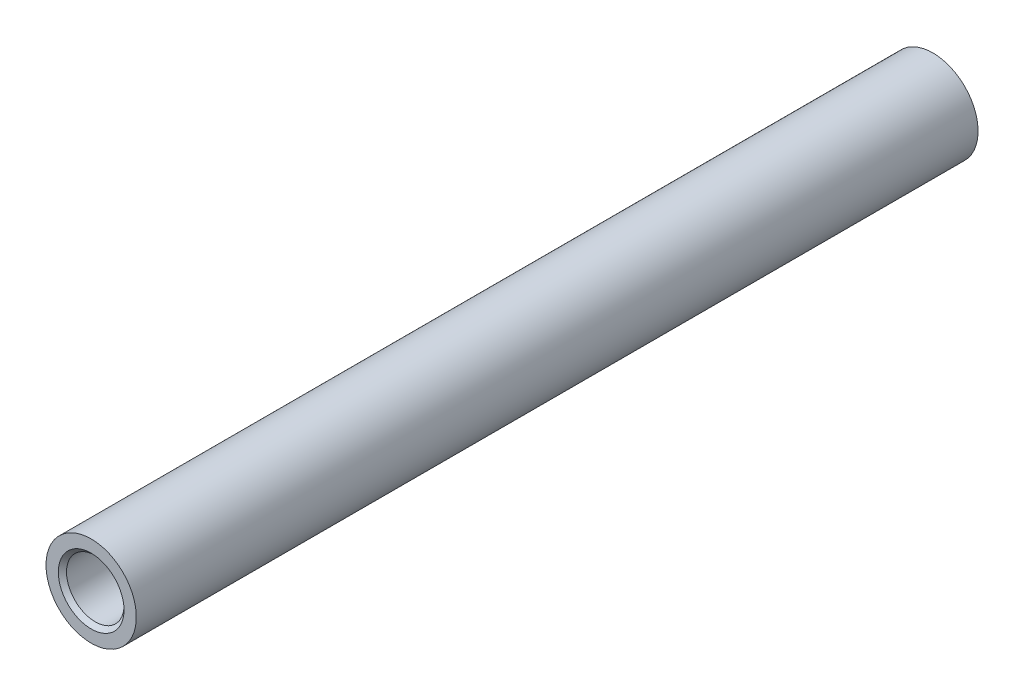
ISO-10303-21;
HEADER;
FILE_DESCRIPTION(('STEP AP214'),'2;1');
FILE_NAME('part.step','',(''),(''),'','','');
FILE_SCHEMA(('AUTOMOTIVE_DESIGN { 1 0 10303 214 1 1 1 1 }'));
ENDSEC;
DATA;
#1=APPLICATION_CONTEXT('core data for automotive mechanical design processes');
#2=APPLICATION_PROTOCOL_DEFINITION('international standard','automotive_design',2000,#1);
#3=PRODUCT_CONTEXT('',#1,'mechanical');
#4=PRODUCT('Part','Part','',(#3));
#5=PRODUCT_RELATED_PRODUCT_CATEGORY('part','',(#4));
#6=PRODUCT_DEFINITION_FORMATION('','',#4);
#7=PRODUCT_DEFINITION_CONTEXT('part definition',#1,'design');
#8=PRODUCT_DEFINITION('design','',#6,#7);
#9=PRODUCT_DEFINITION_SHAPE('','',#8);
#10=(LENGTH_UNIT() NAMED_UNIT(*) SI_UNIT(.MILLI.,.METRE.));
#11=(NAMED_UNIT(*) PLANE_ANGLE_UNIT() SI_UNIT($,.RADIAN.));
#12=(NAMED_UNIT(*) SI_UNIT($,.STERADIAN.) SOLID_ANGLE_UNIT());
#13=UNCERTAINTY_MEASURE_WITH_UNIT(LENGTH_MEASURE(1.E-05),#10,'distance_accuracy_value','');
#14=(GEOMETRIC_REPRESENTATION_CONTEXT(3) GLOBAL_UNCERTAINTY_ASSIGNED_CONTEXT((#13)) GLOBAL_UNIT_ASSIGNED_CONTEXT((#10,
#11,#12)) REPRESENTATION_CONTEXT('',''));
#15=CARTESIAN_POINT('',(0.,0.,0.));
#16=DIRECTION('',(0.,0.,1.));
#17=DIRECTION('',(1.,0.,0.));
#18=AXIS2_PLACEMENT_3D('',#15,#16,#17);
#19=CARTESIAN_POINT('',(0.,0.,102.5));
#20=DIRECTION('',(0.,0.,-1.));
#21=DIRECTION('',(-1.,0.,0.));
#22=AXIS2_PLACEMENT_3D('',#19,#20,#21);
#23=CYLINDRICAL_SURFACE('',#22,7.);
#24=CARTESIAN_POINT('',(0.,0.,101.5));
#25=DIRECTION('',(0.,0.,1.));
#26=DIRECTION('',(1.,0.,0.));
#27=AXIS2_PLACEMENT_3D('',#24,#25,#26);
#28=CIRCLE('',#27,7.);
#29=CARTESIAN_POINT('',(-7.,0.,101.5));
#30=VERTEX_POINT('',#29);
#31=EDGE_CURVE('E43',#30,#30,#28,.T.);
#32=CARTESIAN_POINT('',(0.,0.,-52.5));
#33=DIRECTION('',(0.,0.,-1.));
#34=DIRECTION('',(-1.,0.,0.));
#35=AXIS2_PLACEMENT_3D('',#32,#33,#34);
#36=CIRCLE('',#35,7.);
#37=CARTESIAN_POINT('',(-7.,0.,-52.5));
#38=VERTEX_POINT('',#37);
#39=EDGE_CURVE('E54',#38,#38,#36,.T.);
#40=CARTESIAN_POINT('',(-7.,0.,101.5));
#41=CARTESIAN_POINT('',(-7.,0.,99.8958333333332));
#42=CARTESIAN_POINT('',(-7.,0.,98.2916666666665));
#43=CARTESIAN_POINT('',(-7.,0.,95.0833333333332));
#44=CARTESIAN_POINT('',(-7.,0.,93.4791666666665));
#45=CARTESIAN_POINT('',(-7.,0.,90.2708333333332));
#46=CARTESIAN_POINT('',(-7.,0.,88.6666666666665));
#47=CARTESIAN_POINT('',(-7.,0.,85.4583333333332));
#48=CARTESIAN_POINT('',(-7.,0.,83.8541666666665));
#49=CARTESIAN_POINT('',(-7.,0.,80.6458333333332));
#50=CARTESIAN_POINT('',(-7.,0.,79.0416666666666));
#51=CARTESIAN_POINT('',(-7.,0.,75.8333333333332));
#52=CARTESIAN_POINT('',(-7.,0.,74.2291666666666));
#53=CARTESIAN_POINT('',(-7.,0.,71.0208333333332));
#54=CARTESIAN_POINT('',(-7.,0.,69.4166666666666));
#55=CARTESIAN_POINT('',(-7.,0.,66.2083333333332));
#56=CARTESIAN_POINT('',(-7.,0.,64.6041666666666));
#57=CARTESIAN_POINT('',(-7.,0.,61.3958333333332));
#58=CARTESIAN_POINT('',(-7.,0.,59.7916666666666));
#59=CARTESIAN_POINT('',(-7.,0.,56.5833333333333));
#60=CARTESIAN_POINT('',(-7.,0.,54.9791666666666));
#61=CARTESIAN_POINT('',(-7.,0.,51.7708333333333));
#62=CARTESIAN_POINT('',(-7.,0.,50.1666666666666));
#63=CARTESIAN_POINT('',(-7.,0.,46.9583333333333));
#64=CARTESIAN_POINT('',(-7.,0.,45.3541666666666));
#65=CARTESIAN_POINT('',(-7.,0.,42.1458333333333));
#66=CARTESIAN_POINT('',(-7.,0.,40.5416666666666));
#67=CARTESIAN_POINT('',(-7.,0.,37.3333333333333));
#68=CARTESIAN_POINT('',(-7.,0.,35.7291666666666));
#69=CARTESIAN_POINT('',(-7.,0.,32.5208333333333));
#70=CARTESIAN_POINT('',(-7.,0.,30.9166666666666));
#71=CARTESIAN_POINT('',(-7.,0.,27.7083333333333));
#72=CARTESIAN_POINT('',(-7.,0.,26.1041666666666));
#73=CARTESIAN_POINT('',(-7.,0.,22.8958333333333));
#74=CARTESIAN_POINT('',(-7.,0.,21.2916666666666));
#75=CARTESIAN_POINT('',(-7.,0.,18.0833333333333));
#76=CARTESIAN_POINT('',(-7.,0.,16.4791666666666));
#77=CARTESIAN_POINT('',(-7.,0.,13.2708333333333));
#78=CARTESIAN_POINT('',(-7.,0.,11.6666666666666));
#79=CARTESIAN_POINT('',(-7.,0.,8.45833333333331));
#80=CARTESIAN_POINT('',(-7.,0.,6.85416666666664));
#81=CARTESIAN_POINT('',(-7.,0.,3.64583333333331));
#82=CARTESIAN_POINT('',(-7.,0.,2.04166666666665));
#83=CARTESIAN_POINT('',(-7.,0.,-1.16666666666669));
#84=CARTESIAN_POINT('',(-7.,0.,-2.77083333333335));
#85=CARTESIAN_POINT('',(-7.,0.,-5.97916666666668));
#86=CARTESIAN_POINT('',(-7.,0.,-7.58333333333335));
#87=CARTESIAN_POINT('',(-7.,0.,-10.7916666666667));
#88=CARTESIAN_POINT('',(-7.,0.,-12.3958333333333));
#89=CARTESIAN_POINT('',(-7.,0.,-15.6041666666667));
#90=CARTESIAN_POINT('',(-7.,0.,-17.2083333333333));
#91=CARTESIAN_POINT('',(-7.,0.,-20.4166666666667));
#92=CARTESIAN_POINT('',(-7.,0.,-22.0208333333333));
#93=CARTESIAN_POINT('',(-7.,0.,-25.2291666666667));
#94=CARTESIAN_POINT('',(-7.,0.,-26.8333333333333));
#95=CARTESIAN_POINT('',(-7.,0.,-30.0416666666666));
#96=CARTESIAN_POINT('',(-7.,0.,-31.6458333333333));
#97=CARTESIAN_POINT('',(-7.,0.,-34.8541666666666));
#98=CARTESIAN_POINT('',(-7.,0.,-36.4583333333333));
#99=CARTESIAN_POINT('',(-7.,0.,-39.6666666666666));
#100=CARTESIAN_POINT('',(-7.,0.,-41.2708333333333));
#101=CARTESIAN_POINT('',(-7.,0.,-44.4791666666666));
#102=CARTESIAN_POINT('',(-7.,0.,-46.0833333333333));
#103=CARTESIAN_POINT('',(-7.,0.,-49.2916666666666));
#104=CARTESIAN_POINT('',(-7.,0.,-50.8958333333333));
#105=CARTESIAN_POINT('',(-7.,0.,-52.5));
#106=B_SPLINE_CURVE_WITH_KNOTS('',3,(#40,#41,#42,#43,#44,#45,#46,#47,#48,#49,#50,#51,#52,#53,
#54,#55,#56,#57,#58,#59,#60,#61,#62,#63,#64,#65,#66,#67,#68,#69,#70,#71,#72,#73,#74,#75,#76,#77,
#78,#79,#80,#81,#82,#83,#84,#85,#86,#87,#88,#89,#90,#91,#92,#93,#94,#95,#96,#97,#98,#99,#100,
#101,#102,#103,#104,#105),.UNSPECIFIED.,.F.,.F.,(4,2,2,2,2,2,2,2,2,2,2,2,2,2,2,2,2,2,2,2,2,2,2,
2,2,2,2,2,2,2,2,2,4),(0.,4.81249999999998,9.62499999999998,14.4375,19.25,24.0625,28.875,
33.6874999999999,38.4999999999999,43.3124999999999,48.1249999999999,52.9374999999999,
57.7499999999999,62.5624999999999,67.3749999999999,72.1874999999999,76.9999999999999,
81.8124999999999,86.6249999999999,91.4374999999999,96.2499999999999,101.0625,105.875,110.6875,
115.5,120.3125,125.125,129.9375,134.75,139.5625,144.375,149.1875,154.),.UNSPECIFIED.);
#107=EDGE_CURVE('BSEAM35',#30,#38,#106,.T.);
#108=ORIENTED_EDGE('',*,*,#31,.T.);
#109=ORIENTED_EDGE('',*,*,#39,.T.);
#110=ORIENTED_EDGE('',*,*,#107,.T.);
#111=ORIENTED_EDGE('',*,*,#107,.F.);
#112=EDGE_LOOP('',(#108,#110,#109,#111));
#113=FACE_BOUND('',#112,.T.);
#114=ADVANCED_FACE('F35',(#113),#23,.F.);
#115=CARTESIAN_POINT('',(0.,0.,102.5));
#116=DIRECTION('',(0.,0.,1.));
#117=DIRECTION('',(1.,0.,0.));
#118=AXIS2_PLACEMENT_3D('',#115,#116,#117);
#119=PLANE('',#118);
#120=CARTESIAN_POINT('',(0.,0.,102.5));
#121=DIRECTION('',(0.,0.,1.));
#122=DIRECTION('',(1.,0.,0.));
#123=AXIS2_PLACEMENT_3D('',#120,#121,#122);
#124=CIRCLE('',#123,8.00000000000015);
#125=CARTESIAN_POINT('',(8.00000000000015,0.,102.5));
#126=VERTEX_POINT('',#125);
#127=EDGE_CURVE('E10',#126,#126,#124,.F.);
#128=ORIENTED_EDGE('',*,*,#127,.T.);
#129=EDGE_LOOP('',(#128));
#130=FACE_BOUND('',#129,.T.);
#131=CARTESIAN_POINT('',(0.,0.,102.5));
#132=DIRECTION('',(0.,0.,1.));
#133=DIRECTION('',(1.,0.,0.));
#134=AXIS2_PLACEMENT_3D('',#131,#132,#133);
#135=CIRCLE('',#134,11.);
#136=CARTESIAN_POINT('',(-11.,0.,102.5));
#137=VERTEX_POINT('',#136);
#138=EDGE_CURVE('E47',#137,#137,#135,.T.);
#139=ORIENTED_EDGE('',*,*,#138,.T.);
#140=EDGE_LOOP('',(#139));
#141=FACE_BOUND('',#140,.T.);
#142=ADVANCED_FACE('F78',(#130,#141),#119,.T.);
#143=CARTESIAN_POINT('',(0.,0.,-102.5));
#144=DIRECTION('',(0.,0.,1.));
#145=DIRECTION('',(1.,0.,0.));
#146=AXIS2_PLACEMENT_3D('',#143,#144,#145);
#147=PLANE('',#146);
#148=CARTESIAN_POINT('',(0.,0.,-102.5));
#149=DIRECTION('',(0.,0.,-1.));
#150=DIRECTION('',(-1.,0.,0.));
#151=AXIS2_PLACEMENT_3D('',#148,#149,#150);
#152=CIRCLE('',#151,8.);
#153=CARTESIAN_POINT('',(-8.,0.,-102.5));
#154=VERTEX_POINT('',#153);
#155=EDGE_CURVE('E60',#154,#154,#152,.T.);
#156=ORIENTED_EDGE('',*,*,#155,.F.);
#157=EDGE_LOOP('',(#156));
#158=FACE_BOUND('',#157,.T.);
#159=CARTESIAN_POINT('',(0.,0.,-102.5));
#160=DIRECTION('',(0.,0.,1.));
#161=DIRECTION('',(1.,0.,0.));
#162=AXIS2_PLACEMENT_3D('',#159,#160,#161);
#163=CIRCLE('',#162,11.);
#164=CARTESIAN_POINT('',(-11.,0.,-102.5));
#165=VERTEX_POINT('',#164);
#166=EDGE_CURVE('E51',#165,#165,#163,.T.);
#167=ORIENTED_EDGE('',*,*,#166,.F.);
#168=EDGE_LOOP('',(#167));
#169=FACE_BOUND('',#168,.T.);
#170=ADVANCED_FACE('F75',(#158,#169),#147,.F.);
#171=CARTESIAN_POINT('',(0.,0.,102.5));
#172=DIRECTION('',(0.,0.,-1.));
#173=DIRECTION('',(-1.,0.,0.));
#174=AXIS2_PLACEMENT_3D('',#171,#172,#173);
#175=CYLINDRICAL_SURFACE('',#174,11.);
#176=CARTESIAN_POINT('',(-11.,0.,102.5));
#177=CARTESIAN_POINT('',(-11.,0.,100.364583333333));
#178=CARTESIAN_POINT('',(-11.,0.,98.2291666666667));
#179=CARTESIAN_POINT('',(-11.,0.,93.9583333333333));
#180=CARTESIAN_POINT('',(-11.,0.,91.8229166666667));
#181=CARTESIAN_POINT('',(-11.,0.,87.5520833333333));
#182=CARTESIAN_POINT('',(-11.,0.,85.4166666666667));
#183=CARTESIAN_POINT('',(-11.,0.,81.1458333333333));
#184=CARTESIAN_POINT('',(-11.,0.,79.0104166666667));
#185=CARTESIAN_POINT('',(-11.,0.,74.7395833333333));
#186=CARTESIAN_POINT('',(-11.,0.,72.6041666666667));
#187=CARTESIAN_POINT('',(-11.,0.,68.3333333333333));
#188=CARTESIAN_POINT('',(-11.,0.,66.1979166666667));
#189=CARTESIAN_POINT('',(-11.,0.,61.9270833333333));
#190=CARTESIAN_POINT('',(-11.,0.,59.7916666666667));
#191=CARTESIAN_POINT('',(-11.,0.,55.5208333333333));
#192=CARTESIAN_POINT('',(-11.,0.,53.3854166666667));
#193=CARTESIAN_POINT('',(-11.,0.,49.1145833333333));
#194=CARTESIAN_POINT('',(-11.,0.,46.9791666666667));
#195=CARTESIAN_POINT('',(-11.,0.,42.7083333333333));
#196=CARTESIAN_POINT('',(-11.,0.,40.5729166666667));
#197=CARTESIAN_POINT('',(-11.,0.,36.3020833333333));
#198=CARTESIAN_POINT('',(-11.,0.,34.1666666666667));
#199=CARTESIAN_POINT('',(-11.,0.,29.8958333333333));
#200=CARTESIAN_POINT('',(-11.,0.,27.7604166666667));
#201=CARTESIAN_POINT('',(-11.,0.,23.4895833333333));
#202=CARTESIAN_POINT('',(-11.,0.,21.3541666666667));
#203=CARTESIAN_POINT('',(-11.,0.,17.0833333333333));
#204=CARTESIAN_POINT('',(-11.,0.,14.9479166666667));
#205=CARTESIAN_POINT('',(-11.,0.,10.6770833333333));
#206=CARTESIAN_POINT('',(-11.,0.,8.54166666666666));
#207=CARTESIAN_POINT('',(-11.,0.,4.27083333333332));
#208=CARTESIAN_POINT('',(-11.,0.,2.13541666666665));
#209=CARTESIAN_POINT('',(-11.,0.,-2.13541666666668));
#210=CARTESIAN_POINT('',(-11.,0.,-4.27083333333335));
#211=CARTESIAN_POINT('',(-11.,0.,-8.54166666666668));
#212=CARTESIAN_POINT('',(-11.,0.,-10.6770833333334));
#213=CARTESIAN_POINT('',(-11.,0.,-14.9479166666667));
#214=CARTESIAN_POINT('',(-11.,0.,-17.0833333333334));
#215=CARTESIAN_POINT('',(-11.,0.,-21.3541666666667));
#216=CARTESIAN_POINT('',(-11.,0.,-23.4895833333333));
#217=CARTESIAN_POINT('',(-11.,0.,-27.7604166666667));
#218=CARTESIAN_POINT('',(-11.,0.,-29.8958333333333));
#219=CARTESIAN_POINT('',(-11.,0.,-34.1666666666667));
#220=CARTESIAN_POINT('',(-11.,0.,-36.3020833333333));
#221=CARTESIAN_POINT('',(-11.,0.,-40.5729166666667));
#222=CARTESIAN_POINT('',(-11.,0.,-42.7083333333333));
#223=CARTESIAN_POINT('',(-11.,0.,-46.9791666666667));
#224=CARTESIAN_POINT('',(-11.,0.,-49.1145833333333));
#225=CARTESIAN_POINT('',(-11.,0.,-53.3854166666666));
#226=CARTESIAN_POINT('',(-11.,0.,-55.5208333333333));
#227=CARTESIAN_POINT('',(-11.,0.,-59.7916666666666));
#228=CARTESIAN_POINT('',(-11.,0.,-61.9270833333333));
#229=CARTESIAN_POINT('',(-11.,0.,-66.1979166666666));
#230=CARTESIAN_POINT('',(-11.,0.,-68.3333333333333));
#231=CARTESIAN_POINT('',(-11.,0.,-72.6041666666667));
#232=CARTESIAN_POINT('',(-11.,0.,-74.7395833333333));
#233=CARTESIAN_POINT('',(-11.,0.,-79.0104166666667));
#234=CARTESIAN_POINT('',(-11.,0.,-81.1458333333333));
#235=CARTESIAN_POINT('',(-11.,0.,-85.4166666666667));
#236=CARTESIAN_POINT('',(-11.,0.,-87.5520833333333));
#237=CARTESIAN_POINT('',(-11.,0.,-91.8229166666667));
#238=CARTESIAN_POINT('',(-11.,0.,-93.9583333333333));
#239=CARTESIAN_POINT('',(-11.,0.,-98.2291666666667));
#240=CARTESIAN_POINT('',(-11.,0.,-100.364583333333));
#241=CARTESIAN_POINT('',(-11.,0.,-102.5));
#242=B_SPLINE_CURVE_WITH_KNOTS('',3,(#176,#177,#178,#179,#180,#181,#182,#183,#184,#185,#186,
#187,#188,#189,#190,#191,#192,#193,#194,#195,#196,#197,#198,#199,#200,#201,#202,#203,#204,#205,
#206,#207,#208,#209,#210,#211,#212,#213,#214,#215,#216,#217,#218,#219,#220,#221,#222,#223,#224,
#225,#226,#227,#228,#229,#230,#231,#232,#233,#234,#235,#236,#237,#238,#239,#240,#241),
.UNSPECIFIED.,.F.,.F.,(4,2,2,2,2,2,2,2,2,2,2,2,2,2,2,2,2,2,2,2,2,2,2,2,2,2,2,2,2,2,2,2,4),(0.,
6.40624999999999,12.8125,19.21875,25.625,32.03125,38.4375,44.84375,51.25,57.65625,64.0625,
70.46875,76.875,83.28125,89.6875,96.09375,102.5,108.90625,115.3125,121.71875,128.125,134.53125,
140.9375,147.34375,153.75,160.15625,166.5625,172.96875,179.375,185.78125,192.1875,198.59375,
205.),.UNSPECIFIED.);
#243=EDGE_CURVE('BSEAM71',#137,#165,#242,.T.);
#244=ORIENTED_EDGE('',*,*,#138,.F.);
#245=ORIENTED_EDGE('',*,*,#166,.T.);
#246=ORIENTED_EDGE('',*,*,#243,.T.);
#247=ORIENTED_EDGE('',*,*,#243,.F.);
#248=EDGE_LOOP('',(#244,#246,#245,#247));
#249=FACE_BOUND('',#248,.T.);
#250=ADVANCED_FACE('F71',(#249),#175,.T.);
#251=CARTESIAN_POINT('',(0.,0.,-52.5));
#252=DIRECTION('',(0.,0.,-1.));
#253=DIRECTION('',(-1.,0.,0.));
#254=AXIS2_PLACEMENT_3D('',#251,#252,#253);
#255=CYLINDRICAL_SURFACE('',#254,8.);
#256=CARTESIAN_POINT('',(0.,0.,-52.5));
#257=DIRECTION('',(0.,0.,-1.));
#258=DIRECTION('',(-1.,0.,0.));
#259=AXIS2_PLACEMENT_3D('',#256,#257,#258);
#260=CIRCLE('',#259,8.);
#261=CARTESIAN_POINT('',(-8.,0.,-52.5));
#262=VERTEX_POINT('',#261);
#263=EDGE_CURVE('E57',#262,#262,#260,.T.);
#264=ORIENTED_EDGE('',*,*,#263,.F.);
#265=EDGE_LOOP('',(#264));
#266=FACE_BOUND('',#265,.T.);
#267=ORIENTED_EDGE('',*,*,#155,.T.);
#268=EDGE_LOOP('',(#267));
#269=FACE_BOUND('',#268,.T.);
#270=ADVANCED_FACE('F68',(#266,#269),#255,.F.);
#271=CARTESIAN_POINT('',(0.,0.,-52.5));
#272=DIRECTION('',(0.,0.,-1.));
#273=DIRECTION('',(-1.,0.,0.));
#274=AXIS2_PLACEMENT_3D('',#271,#272,#273);
#275=PLANE('',#274);
#276=ORIENTED_EDGE('',*,*,#39,.F.);
#277=EDGE_LOOP('',(#276));
#278=FACE_BOUND('',#277,.T.);
#279=ORIENTED_EDGE('',*,*,#263,.T.);
#280=EDGE_LOOP('',(#279));
#281=FACE_BOUND('',#280,.T.);
#282=ADVANCED_FACE('F66',(#278,#281),#275,.T.);
#283=CARTESIAN_POINT('',(0.,0.,101.5));
#284=DIRECTION('',(0.,0.,1.));
#285=DIRECTION('',(1.,0.,0.));
#286=AXIS2_PLACEMENT_3D('',#283,#284,#285);
#287=CONICAL_SURFACE('',#286,7.,0.785398163397459);
#288=ORIENTED_EDGE('',*,*,#127,.F.);
#289=EDGE_LOOP('',(#288));
#290=FACE_BOUND('',#289,.T.);
#291=ORIENTED_EDGE('',*,*,#31,.F.);
#292=EDGE_LOOP('',(#291));
#293=FACE_BOUND('',#292,.T.);
#294=ADVANCED_FACE('F38',(#290,#293),#287,.F.);
#295=CLOSED_SHELL('',(#114,#142,#170,#250,#270,#282,#294));
#296=MANIFOLD_SOLID_BREP('B2',#295);
#297=ADVANCED_BREP_SHAPE_REPRESENTATION('',(#18,#296),#14);
#298=SHAPE_DEFINITION_REPRESENTATION(#9,#297);
ENDSEC;
END-ISO-10303-21;
